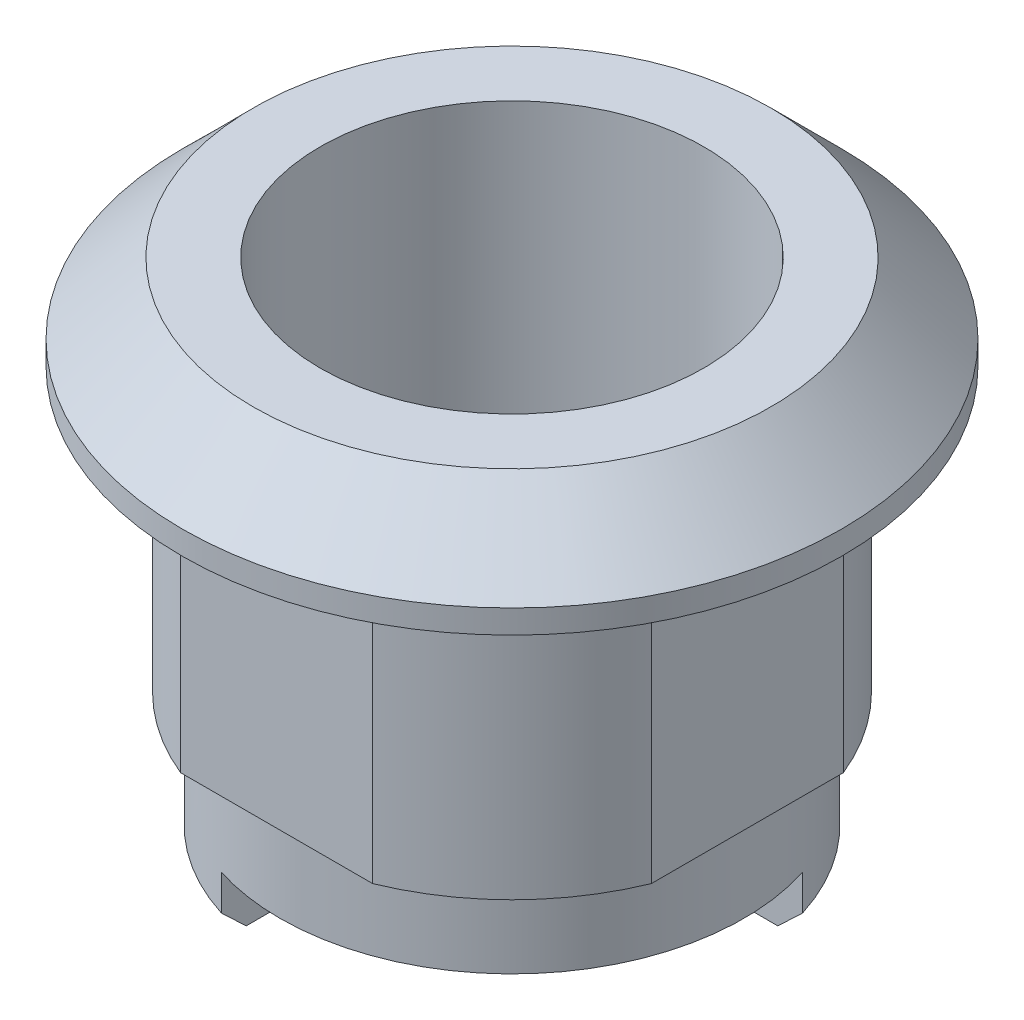
ISO-10303-21;
HEADER;
FILE_DESCRIPTION(('STEP AP214'),'2;1');
FILE_NAME('part.step','',(''),(''),'','','');
FILE_SCHEMA(('AUTOMOTIVE_DESIGN { 1 0 10303 214 1 1 1 1 }'));
ENDSEC;
DATA;
#1=APPLICATION_CONTEXT('core data for automotive mechanical design processes');
#2=APPLICATION_PROTOCOL_DEFINITION('international standard','automotive_design',2000,#1);
#3=PRODUCT_CONTEXT('',#1,'mechanical');
#4=PRODUCT('Part','Part','',(#3));
#5=PRODUCT_RELATED_PRODUCT_CATEGORY('part','',(#4));
#6=PRODUCT_DEFINITION_FORMATION('','',#4);
#7=PRODUCT_DEFINITION_CONTEXT('part definition',#1,'design');
#8=PRODUCT_DEFINITION('design','',#6,#7);
#9=PRODUCT_DEFINITION_SHAPE('','',#8);
#10=(LENGTH_UNIT() NAMED_UNIT(*) SI_UNIT(.MILLI.,.METRE.));
#11=(NAMED_UNIT(*) PLANE_ANGLE_UNIT() SI_UNIT($,.RADIAN.));
#12=(NAMED_UNIT(*) SI_UNIT($,.STERADIAN.) SOLID_ANGLE_UNIT());
#13=UNCERTAINTY_MEASURE_WITH_UNIT(LENGTH_MEASURE(1.E-05),#10,'distance_accuracy_value','');
#14=(GEOMETRIC_REPRESENTATION_CONTEXT(3) GLOBAL_UNCERTAINTY_ASSIGNED_CONTEXT((#13)) GLOBAL_UNIT_ASSIGNED_CONTEXT((#10,
#11,#12)) REPRESENTATION_CONTEXT('',''));
#15=CARTESIAN_POINT('',(0.,0.,0.));
#16=DIRECTION('',(0.,0.,1.));
#17=DIRECTION('',(1.,0.,0.));
#18=AXIS2_PLACEMENT_3D('',#15,#16,#17);
#19=CARTESIAN_POINT('',(9.85,-5.05,0.));
#20=DIRECTION('',(0.,1.,0.));
#21=DIRECTION('',(0.,0.,1.));
#22=AXIS2_PLACEMENT_3D('',#19,#20,#21);
#23=PLANE('',#22);
#24=CARTESIAN_POINT('',(0.,-5.05,0.));
#25=DIRECTION('',(0.,1.,0.));
#26=DIRECTION('',(0.,0.,1.));
#27=AXIS2_PLACEMENT_3D('',#24,#25,#26);
#28=CIRCLE('',#27,9.85);
#29=CARTESIAN_POINT('',(0.,-5.05,9.85));
#30=VERTEX_POINT('',#29);
#31=EDGE_CURVE('E153',#30,#30,#28,.T.);
#32=ORIENTED_EDGE('',*,*,#31,.T.);
#33=EDGE_LOOP('',(#32));
#34=FACE_BOUND('',#33,.T.);
#35=DIRECTION('',(0.,0.,-1.));
#36=VECTOR('',#35,1.);
#37=CARTESIAN_POINT('',(10.,-5.05,0.));
#38=LINE('',#37,#36);
#39=CARTESIAN_POINT('',(10.,-5.05,4.07921561087424));
#40=VERTEX_POINT('',#39);
#41=CARTESIAN_POINT('',(10.,-5.05,-4.07921561087422));
#42=VERTEX_POINT('',#41);
#43=EDGE_CURVE('E316',#40,#42,#38,.T.);
#44=ORIENTED_EDGE('',*,*,#43,.F.);
#45=CARTESIAN_POINT('',(0.,-5.05,0.));
#46=DIRECTION('',(0.,1.,0.));
#47=DIRECTION('',(0.,0.,1.));
#48=AXIS2_PLACEMENT_3D('',#45,#46,#47);
#49=CIRCLE('',#48,10.8);
#50=CARTESIAN_POINT('',(4.07921561087423,-5.05,10.));
#51=VERTEX_POINT('',#50);
#52=EDGE_CURVE('E159',#51,#40,#49,.T.);
#53=ORIENTED_EDGE('',*,*,#52,.F.);
#54=DIRECTION('',(1.,0.,0.));
#55=VECTOR('',#54,1.);
#56=CARTESIAN_POINT('',(9.85,-5.05,10.));
#57=LINE('',#56,#55);
#58=CARTESIAN_POINT('',(-4.07921561087423,-5.05,10.));
#59=VERTEX_POINT('',#58);
#60=EDGE_CURVE('E331',#59,#51,#57,.T.);
#61=ORIENTED_EDGE('',*,*,#60,.F.);
#62=CARTESIAN_POINT('',(-10.,-5.05,4.07921561087422));
#63=VERTEX_POINT('',#62);
#64=EDGE_CURVE('E268',#63,#59,#49,.T.);
#65=ORIENTED_EDGE('',*,*,#64,.F.);
#66=DIRECTION('',(0.,0.,1.));
#67=VECTOR('',#66,1.);
#68=CARTESIAN_POINT('',(-10.,-5.05,0.));
#69=LINE('',#68,#67);
#70=CARTESIAN_POINT('',(-10.,-5.05,-4.07921561087422));
#71=VERTEX_POINT('',#70);
#72=EDGE_CURVE('E300',#71,#63,#69,.T.);
#73=ORIENTED_EDGE('',*,*,#72,.F.);
#74=CARTESIAN_POINT('',(-4.07921561087423,-5.05,-10.));
#75=VERTEX_POINT('',#74);
#76=EDGE_CURVE('E277',#75,#71,#49,.T.);
#77=ORIENTED_EDGE('',*,*,#76,.F.);
#78=DIRECTION('',(-1.,0.,0.));
#79=VECTOR('',#78,1.);
#80=CARTESIAN_POINT('',(9.85,-5.05,-10.));
#81=LINE('',#80,#79);
#82=CARTESIAN_POINT('',(4.07921561087423,-5.05,-10.));
#83=VERTEX_POINT('',#82);
#84=EDGE_CURVE('E299',#83,#75,#81,.T.);
#85=ORIENTED_EDGE('',*,*,#84,.F.);
#86=EDGE_CURVE('E271',#42,#83,#49,.T.);
#87=ORIENTED_EDGE('',*,*,#86,.F.);
#88=EDGE_LOOP('',(#44,#53,#61,#65,#73,#77,#85,#87));
#89=FACE_BOUND('',#88,.T.);
#90=ADVANCED_FACE('F34',(#34,#89),#23,.F.);
#91=CARTESIAN_POINT('',(0.,15.2972027972028,0.));
#92=DIRECTION('',(0.,1.,0.));
#93=DIRECTION('',(0.,0.,1.));
#94=AXIS2_PLACEMENT_3D('',#91,#92,#93);
#95=CYLINDRICAL_SURFACE('',#94,10.8);
#96=DIRECTION('',(0.,1.,0.));
#97=VECTOR('',#96,1.);
#98=CARTESIAN_POINT('',(10.,15.2972027972028,-4.07921561087423));
#99=LINE('',#98,#97);
#100=CARTESIAN_POINT('',(10.,6.95,-4.07921561087422));
#101=VERTEX_POINT('',#100);
#102=EDGE_CURVE('E262',#42,#101,#99,.T.);
#103=ORIENTED_EDGE('',*,*,#102,.F.);
#104=ORIENTED_EDGE('',*,*,#86,.T.);
#105=DIRECTION('',(0.,1.,0.));
#106=VECTOR('',#105,1.);
#107=CARTESIAN_POINT('',(4.07921561087423,15.2972027972028,-10.));
#108=LINE('',#107,#106);
#109=CARTESIAN_POINT('',(4.07921561087423,6.95,-10.));
#110=VERTEX_POINT('',#109);
#111=EDGE_CURVE('E305',#110,#83,#108,.F.);
#112=ORIENTED_EDGE('',*,*,#111,.F.);
#113=CARTESIAN_POINT('',(0.,6.95,0.));
#114=DIRECTION('',(0.,1.,0.));
#115=DIRECTION('',(0.,0.,1.));
#116=AXIS2_PLACEMENT_3D('',#113,#114,#115);
#117=CIRCLE('',#116,10.8);
#118=EDGE_CURVE('E269',#101,#110,#117,.T.);
#119=ORIENTED_EDGE('',*,*,#118,.F.);
#120=EDGE_LOOP('',(#103,#104,#112,#119));
#121=FACE_BOUND('',#120,.T.);
#122=ADVANCED_FACE('F224',(#121),#95,.T.);
#123=DIRECTION('',(0.,1.,0.));
#124=VECTOR('',#123,1.);
#125=CARTESIAN_POINT('',(10.,15.2972027972028,4.07921561087424));
#126=LINE('',#125,#124);
#127=CARTESIAN_POINT('',(10.,6.95,4.07921561087423));
#128=VERTEX_POINT('',#127);
#129=EDGE_CURVE('E314',#128,#40,#126,.F.);
#130=ORIENTED_EDGE('',*,*,#129,.F.);
#131=CARTESIAN_POINT('',(4.07921561087424,6.95,10.));
#132=VERTEX_POINT('',#131);
#133=EDGE_CURVE('E266',#132,#128,#117,.T.);
#134=ORIENTED_EDGE('',*,*,#133,.F.);
#135=DIRECTION('',(0.,1.,0.));
#136=VECTOR('',#135,1.);
#137=CARTESIAN_POINT('',(4.07921561087423,15.2972027972028,10.));
#138=LINE('',#137,#136);
#139=EDGE_CURVE('E307',#51,#132,#138,.T.);
#140=ORIENTED_EDGE('',*,*,#139,.F.);
#141=ORIENTED_EDGE('',*,*,#52,.T.);
#142=EDGE_LOOP('',(#130,#134,#140,#141));
#143=FACE_BOUND('',#142,.T.);
#144=ADVANCED_FACE('F227',(#143),#95,.T.);
#145=DIRECTION('',(0.,1.,0.));
#146=VECTOR('',#145,1.);
#147=CARTESIAN_POINT('',(-4.07921561087423,15.2972027972028,-10.));
#148=LINE('',#147,#146);
#149=CARTESIAN_POINT('',(-4.07921561087423,6.95,-10.));
#150=VERTEX_POINT('',#149);
#151=EDGE_CURVE('E293',#75,#150,#148,.T.);
#152=ORIENTED_EDGE('',*,*,#151,.F.);
#153=ORIENTED_EDGE('',*,*,#76,.T.);
#154=DIRECTION('',(0.,1.,0.));
#155=VECTOR('',#154,1.);
#156=CARTESIAN_POINT('',(-10.,15.2972027972028,-4.07921561087422));
#157=LINE('',#156,#155);
#158=CARTESIAN_POINT('',(-10.,6.95,-4.07921561087422));
#159=VERTEX_POINT('',#158);
#160=EDGE_CURVE('E290',#159,#71,#157,.F.);
#161=ORIENTED_EDGE('',*,*,#160,.F.);
#162=EDGE_CURVE('E323',#150,#159,#117,.T.);
#163=ORIENTED_EDGE('',*,*,#162,.F.);
#164=EDGE_LOOP('',(#152,#153,#161,#163));
#165=FACE_BOUND('',#164,.T.);
#166=ADVANCED_FACE('F288',(#165),#95,.T.);
#167=DIRECTION('',(0.,1.,0.));
#168=VECTOR('',#167,1.);
#169=CARTESIAN_POINT('',(-10.,15.2972027972028,4.07921561087422));
#170=LINE('',#169,#168);
#171=CARTESIAN_POINT('',(-10.,6.95,4.07921561087422));
#172=VERTEX_POINT('',#171);
#173=EDGE_CURVE('E303',#63,#172,#170,.T.);
#174=ORIENTED_EDGE('',*,*,#173,.F.);
#175=ORIENTED_EDGE('',*,*,#64,.T.);
#176=DIRECTION('',(0.,1.,0.));
#177=VECTOR('',#176,1.);
#178=CARTESIAN_POINT('',(-4.07921561087423,15.2972027972028,10.));
#179=LINE('',#178,#177);
#180=CARTESIAN_POINT('',(-4.07921561087424,6.95,10.));
#181=VERTEX_POINT('',#180);
#182=EDGE_CURVE('E330',#181,#59,#179,.F.);
#183=ORIENTED_EDGE('',*,*,#182,.F.);
#184=EDGE_CURVE('E259',#172,#181,#117,.T.);
#185=ORIENTED_EDGE('',*,*,#184,.F.);
#186=EDGE_LOOP('',(#174,#175,#183,#185));
#187=FACE_BOUND('',#186,.T.);
#188=ADVANCED_FACE('F229',(#187),#95,.T.);
#189=CARTESIAN_POINT('',(5.1,-4.65,0.));
#190=DIRECTION('',(0.,-1.,0.));
#191=DIRECTION('',(0.,0.,-1.));
#192=AXIS2_PLACEMENT_3D('',#189,#190,#191);
#193=PLANE('',#192);
#194=CARTESIAN_POINT('',(0.,-4.65,0.));
#195=DIRECTION('',(0.,1.,0.));
#196=DIRECTION('',(0.,0.,1.));
#197=AXIS2_PLACEMENT_3D('',#194,#195,#196);
#198=CIRCLE('',#197,5.1);
#199=CARTESIAN_POINT('',(0.,-4.65,5.1));
#200=VERTEX_POINT('',#199);
#201=EDGE_CURVE('E152',#200,#200,#198,.T.);
#202=ORIENTED_EDGE('',*,*,#201,.F.);
#203=EDGE_LOOP('',(#202));
#204=FACE_BOUND('',#203,.T.);
#205=CARTESIAN_POINT('',(0.,-4.65,0.));
#206=DIRECTION('',(0.,1.,0.));
#207=DIRECTION('',(0.,0.,1.));
#208=AXIS2_PLACEMENT_3D('',#205,#206,#207);
#209=CIRCLE('',#208,8.15);
#210=CARTESIAN_POINT('',(0.,-4.65,8.15));
#211=VERTEX_POINT('',#210);
#212=EDGE_CURVE('E256',#211,#211,#209,.T.);
#213=ORIENTED_EDGE('',*,*,#212,.T.);
#214=EDGE_LOOP('',(#213));
#215=FACE_BOUND('',#214,.T.);
#216=ADVANCED_FACE('F240',(#204,#215),#193,.F.);
#217=CARTESIAN_POINT('',(0.,15.2972027972028,0.));
#218=DIRECTION('',(0.,1.,0.));
#219=DIRECTION('',(0.,0.,1.));
#220=AXIS2_PLACEMENT_3D('',#217,#218,#219);
#221=CYLINDRICAL_SURFACE('',#220,5.1);
#222=CARTESIAN_POINT('',(0.,-8.45,0.));
#223=DIRECTION('',(0.,1.,0.));
#224=DIRECTION('',(0.,0.,1.));
#225=AXIS2_PLACEMENT_3D('',#222,#223,#224);
#226=CIRCLE('',#225,5.1);
#227=CARTESIAN_POINT('',(4.16022835911684,-8.45,-2.95));
#228=VERTEX_POINT('',#227);
#229=CARTESIAN_POINT('',(-2.95,-8.45,4.16022835911684));
#230=VERTEX_POINT('',#229);
#231=EDGE_CURVE('E147',#228,#230,#226,.F.);
#232=ORIENTED_EDGE('',*,*,#231,.T.);
#233=DIRECTION('',(0.,1.,0.));
#234=VECTOR('',#233,1.);
#235=CARTESIAN_POINT('',(-2.95,15.2972027972028,4.16022835911684));
#236=LINE('',#235,#234);
#237=CARTESIAN_POINT('',(-2.95,-10.95,4.16022835911684));
#238=VERTEX_POINT('',#237);
#239=EDGE_CURVE('E135',#230,#238,#236,.F.);
#240=ORIENTED_EDGE('',*,*,#239,.T.);
#241=CARTESIAN_POINT('',(0.,-10.95,0.));
#242=DIRECTION('',(0.,1.,0.));
#243=DIRECTION('',(0.,0.,1.));
#244=AXIS2_PLACEMENT_3D('',#241,#242,#243);
#245=CIRCLE('',#244,5.1);
#246=CARTESIAN_POINT('',(4.16022835911684,-10.95,-2.95));
#247=VERTEX_POINT('',#246);
#248=EDGE_CURVE('E146',#247,#238,#245,.T.);
#249=ORIENTED_EDGE('',*,*,#248,.F.);
#250=DIRECTION('',(0.,1.,0.));
#251=VECTOR('',#250,1.);
#252=CARTESIAN_POINT('',(4.16022835911684,15.2972027972028,-2.95));
#253=LINE('',#252,#251);
#254=EDGE_CURVE('E149',#247,#228,#253,.T.);
#255=ORIENTED_EDGE('',*,*,#254,.T.);
#256=EDGE_LOOP('',(#232,#240,#249,#255));
#257=FACE_BOUND('',#256,.T.);
#258=ORIENTED_EDGE('',*,*,#201,.T.);
#259=EDGE_LOOP('',(#258));
#260=FACE_BOUND('',#259,.T.);
#261=ADVANCED_FACE('F143',(#257,#260),#221,.F.);
#262=CARTESIAN_POINT('',(9.85,-10.95,0.));
#263=DIRECTION('',(0.,1.,0.));
#264=DIRECTION('',(0.,0.,1.));
#265=AXIS2_PLACEMENT_3D('',#262,#263,#264);
#266=PLANE('',#265);
#267=DIRECTION('',(0.,0.,-1.));
#268=VECTOR('',#267,1.);
#269=CARTESIAN_POINT('',(-2.95,-10.95,-2.95));
#270=LINE('',#269,#268);
#271=CARTESIAN_POINT('',(-2.95,-10.95,8.34386001800128));
#272=VERTEX_POINT('',#271);
#273=EDGE_CURVE('E131',#272,#238,#270,.T.);
#274=ORIENTED_EDGE('',*,*,#273,.F.);
#275=CARTESIAN_POINT('',(0.,-10.95,0.));
#276=DIRECTION('',(0.,1.,0.));
#277=DIRECTION('',(0.,0.,1.));
#278=AXIS2_PLACEMENT_3D('',#275,#276,#277);
#279=CIRCLE('',#278,8.85000000000001);
#280=CARTESIAN_POINT('',(8.34386001800128,-10.95,-2.95));
#281=VERTEX_POINT('',#280);
#282=EDGE_CURVE('E48',#272,#281,#279,.F.);
#283=ORIENTED_EDGE('',*,*,#282,.T.);
#284=DIRECTION('',(1.,0.,0.));
#285=VECTOR('',#284,1.);
#286=CARTESIAN_POINT('',(-2.95,-10.95,-2.95));
#287=LINE('',#286,#285);
#288=EDGE_CURVE('E138',#247,#281,#287,.T.);
#289=ORIENTED_EDGE('',*,*,#288,.F.);
#290=ORIENTED_EDGE('',*,*,#248,.T.);
#291=EDGE_LOOP('',(#274,#283,#289,#290));
#292=FACE_BOUND('',#291,.T.);
#293=ADVANCED_FACE('F151',(#292),#266,.F.);
#294=CARTESIAN_POINT('',(0.,15.2972027972028,0.));
#295=DIRECTION('',(0.,1.,0.));
#296=DIRECTION('',(0.,0.,1.));
#297=AXIS2_PLACEMENT_3D('',#294,#295,#296);
#298=CYLINDRICAL_SURFACE('',#297,9.85);
#299=DIRECTION('',(0.,1.,0.));
#300=VECTOR('',#299,1.);
#301=CARTESIAN_POINT('',(9.39787209957659,15.2972027972028,-2.95));
#302=LINE('',#301,#300);
#303=CARTESIAN_POINT('',(9.39787209957659,-8.45,-2.95));
#304=VERTEX_POINT('',#303);
#305=CARTESIAN_POINT('',(9.39787209957659,-9.95000000000001,-2.95));
#306=VERTEX_POINT('',#305);
#307=EDGE_CURVE('E171',#304,#306,#302,.F.);
#308=ORIENTED_EDGE('',*,*,#307,.T.);
#309=CARTESIAN_POINT('',(0.,-9.95000000000001,0.));
#310=DIRECTION('',(0.,1.,0.));
#311=DIRECTION('',(0.,0.,1.));
#312=AXIS2_PLACEMENT_3D('',#309,#310,#311);
#313=CIRCLE('',#312,9.85);
#314=CARTESIAN_POINT('',(-2.95,-9.95000000000001,9.39787209957659));
#315=VERTEX_POINT('',#314);
#316=EDGE_CURVE('E176',#306,#315,#313,.T.);
#317=ORIENTED_EDGE('',*,*,#316,.T.);
#318=DIRECTION('',(0.,1.,0.));
#319=VECTOR('',#318,1.);
#320=CARTESIAN_POINT('',(-2.95,15.2972027972028,9.39787209957659));
#321=LINE('',#320,#319);
#322=CARTESIAN_POINT('',(-2.95,-8.45,9.39787209957659));
#323=VERTEX_POINT('',#322);
#324=EDGE_CURVE('E174',#315,#323,#321,.T.);
#325=ORIENTED_EDGE('',*,*,#324,.T.);
#326=CARTESIAN_POINT('',(0.,-8.45,0.));
#327=DIRECTION('',(0.,1.,0.));
#328=DIRECTION('',(0.,0.,1.));
#329=AXIS2_PLACEMENT_3D('',#326,#327,#328);
#330=CIRCLE('',#329,9.85);
#331=EDGE_CURVE('E168',#323,#304,#330,.T.);
#332=ORIENTED_EDGE('',*,*,#331,.T.);
#333=EDGE_LOOP('',(#308,#317,#325,#332));
#334=FACE_BOUND('',#333,.T.);
#335=ORIENTED_EDGE('',*,*,#31,.F.);
#336=EDGE_LOOP('',(#335));
#337=FACE_BOUND('',#336,.T.);
#338=ADVANCED_FACE('F222',(#334,#337),#298,.T.);
#339=CARTESIAN_POINT('',(14.,6.95,0.));
#340=DIRECTION('',(0.,1.,0.));
#341=DIRECTION('',(0.,0.,1.));
#342=AXIS2_PLACEMENT_3D('',#339,#340,#341);
#343=PLANE('',#342);
#344=ORIENTED_EDGE('',*,*,#133,.T.);
#345=DIRECTION('',(0.,0.,1.));
#346=VECTOR('',#345,1.);
#347=CARTESIAN_POINT('',(10.,6.95,10.));
#348=LINE('',#347,#346);
#349=EDGE_CURVE('E320',#101,#128,#348,.T.);
#350=ORIENTED_EDGE('',*,*,#349,.F.);
#351=ORIENTED_EDGE('',*,*,#118,.T.);
#352=DIRECTION('',(1.,0.,0.));
#353=VECTOR('',#352,1.);
#354=CARTESIAN_POINT('',(-10.,6.95,-10.));
#355=LINE('',#354,#353);
#356=EDGE_CURVE('E148',#150,#110,#355,.T.);
#357=ORIENTED_EDGE('',*,*,#356,.F.);
#358=ORIENTED_EDGE('',*,*,#162,.T.);
#359=DIRECTION('',(0.,0.,-1.));
#360=VECTOR('',#359,1.);
#361=CARTESIAN_POINT('',(-10.,6.95,10.));
#362=LINE('',#361,#360);
#363=EDGE_CURVE('E329',#172,#159,#362,.T.);
#364=ORIENTED_EDGE('',*,*,#363,.F.);
#365=ORIENTED_EDGE('',*,*,#184,.T.);
#366=DIRECTION('',(-1.,0.,0.));
#367=VECTOR('',#366,1.);
#368=CARTESIAN_POINT('',(-10.,6.95,10.));
#369=LINE('',#368,#367);
#370=EDGE_CURVE('E327',#132,#181,#369,.T.);
#371=ORIENTED_EDGE('',*,*,#370,.F.);
#372=EDGE_LOOP('',(#344,#350,#351,#357,#358,#364,#365,#371));
#373=FACE_BOUND('',#372,.T.);
#374=CARTESIAN_POINT('',(0.,6.95,0.));
#375=DIRECTION('',(0.,1.,0.));
#376=DIRECTION('',(0.,0.,1.));
#377=AXIS2_PLACEMENT_3D('',#374,#375,#376);
#378=CIRCLE('',#377,14.);
#379=CARTESIAN_POINT('',(0.,6.95,14.));
#380=VERTEX_POINT('',#379);
#381=EDGE_CURVE('E255',#380,#380,#378,.T.);
#382=ORIENTED_EDGE('',*,*,#381,.F.);
#383=EDGE_LOOP('',(#382));
#384=FACE_BOUND('',#383,.T.);
#385=ADVANCED_FACE('F218',(#373,#384),#343,.F.);
#386=CARTESIAN_POINT('',(0.,15.2972027972028,0.));
#387=DIRECTION('',(0.,1.,0.));
#388=DIRECTION('',(0.,0.,1.));
#389=AXIS2_PLACEMENT_3D('',#386,#387,#388);
#390=CYLINDRICAL_SURFACE('',#389,14.);
#391=CARTESIAN_POINT('',(0.,7.94999999999999,0.));
#392=DIRECTION('',(0.,-1.,0.));
#393=DIRECTION('',(0.,0.,-1.));
#394=AXIS2_PLACEMENT_3D('',#391,#392,#393);
#395=CIRCLE('',#394,14.);
#396=CARTESIAN_POINT('',(0.,7.94999999999999,-14.));
#397=VERTEX_POINT('',#396);
#398=EDGE_CURVE('E165',#397,#397,#395,.T.);
#399=ORIENTED_EDGE('',*,*,#398,.T.);
#400=EDGE_LOOP('',(#399));
#401=FACE_BOUND('',#400,.T.);
#402=ORIENTED_EDGE('',*,*,#381,.T.);
#403=EDGE_LOOP('',(#402));
#404=FACE_BOUND('',#403,.T.);
#405=ADVANCED_FACE('F214',(#401,#404),#390,.T.);
#406=CARTESIAN_POINT('',(8.15,10.95,0.));
#407=DIRECTION('',(0.,-1.,0.));
#408=DIRECTION('',(0.,0.,-1.));
#409=AXIS2_PLACEMENT_3D('',#406,#407,#408);
#410=PLANE('',#409);
#411=CARTESIAN_POINT('',(0.,10.95,0.));
#412=DIRECTION('',(0.,-1.,0.));
#413=DIRECTION('',(0.,0.,-1.));
#414=AXIS2_PLACEMENT_3D('',#411,#412,#413);
#415=CIRCLE('',#414,11.);
#416=CARTESIAN_POINT('',(0.,10.95,-11.));
#417=VERTEX_POINT('',#416);
#418=EDGE_CURVE('E156',#417,#417,#415,.F.);
#419=ORIENTED_EDGE('',*,*,#418,.T.);
#420=EDGE_LOOP('',(#419));
#421=FACE_BOUND('',#420,.T.);
#422=CARTESIAN_POINT('',(0.,10.95,0.));
#423=DIRECTION('',(0.,1.,0.));
#424=DIRECTION('',(0.,0.,1.));
#425=AXIS2_PLACEMENT_3D('',#422,#423,#424);
#426=CIRCLE('',#425,8.15);
#427=CARTESIAN_POINT('',(0.,10.95,8.15));
#428=VERTEX_POINT('',#427);
#429=EDGE_CURVE('E253',#428,#428,#426,.T.);
#430=ORIENTED_EDGE('',*,*,#429,.F.);
#431=EDGE_LOOP('',(#430));
#432=FACE_BOUND('',#431,.T.);
#433=ADVANCED_FACE('F210',(#421,#432),#410,.F.);
#434=CARTESIAN_POINT('',(0.,15.2972027972028,0.));
#435=DIRECTION('',(0.,1.,0.));
#436=DIRECTION('',(0.,0.,1.));
#437=AXIS2_PLACEMENT_3D('',#434,#435,#436);
#438=CYLINDRICAL_SURFACE('',#437,8.15);
#439=ORIENTED_EDGE('',*,*,#212,.F.);
#440=EDGE_LOOP('',(#439));
#441=FACE_BOUND('',#440,.T.);
#442=ORIENTED_EDGE('',*,*,#429,.T.);
#443=EDGE_LOOP('',(#442));
#444=FACE_BOUND('',#443,.T.);
#445=ADVANCED_FACE('F207',(#441,#444),#438,.F.);
#446=CARTESIAN_POINT('',(0.,10.95,0.));
#447=DIRECTION('',(0.,-1.,0.));
#448=DIRECTION('',(0.,0.,-1.));
#449=AXIS2_PLACEMENT_3D('',#446,#447,#448);
#450=CONICAL_SURFACE('',#449,11.,0.785398163397446);
#451=ORIENTED_EDGE('',*,*,#398,.F.);
#452=EDGE_LOOP('',(#451));
#453=FACE_BOUND('',#452,.T.);
#454=ORIENTED_EDGE('',*,*,#418,.F.);
#455=EDGE_LOOP('',(#454));
#456=FACE_BOUND('',#455,.T.);
#457=ADVANCED_FACE('F195',(#453,#456),#450,.T.);
#458=CARTESIAN_POINT('',(-10.,59.7832524564484,10.));
#459=DIRECTION('',(0.,0.,1.));
#460=DIRECTION('',(1.,0.,0.));
#461=AXIS2_PLACEMENT_3D('',#458,#459,#460);
#462=PLANE('',#461);
#463=ORIENTED_EDGE('',*,*,#139,.T.);
#464=ORIENTED_EDGE('',*,*,#370,.T.);
#465=ORIENTED_EDGE('',*,*,#182,.T.);
#466=ORIENTED_EDGE('',*,*,#60,.T.);
#467=EDGE_LOOP('',(#463,#464,#465,#466));
#468=FACE_BOUND('',#467,.T.);
#469=ADVANCED_FACE('F191',(#468),#462,.T.);
#470=CARTESIAN_POINT('',(-10.,59.7832524564484,10.));
#471=DIRECTION('',(-1.,0.,0.));
#472=DIRECTION('',(0.,0.,1.));
#473=AXIS2_PLACEMENT_3D('',#470,#471,#472);
#474=PLANE('',#473);
#475=ORIENTED_EDGE('',*,*,#173,.T.);
#476=ORIENTED_EDGE('',*,*,#363,.T.);
#477=ORIENTED_EDGE('',*,*,#160,.T.);
#478=ORIENTED_EDGE('',*,*,#72,.T.);
#479=EDGE_LOOP('',(#475,#476,#477,#478));
#480=FACE_BOUND('',#479,.T.);
#481=ADVANCED_FACE('F194',(#480),#474,.T.);
#482=CARTESIAN_POINT('',(-10.,59.7832524564484,-10.));
#483=DIRECTION('',(0.,0.,-1.));
#484=DIRECTION('',(-1.,0.,0.));
#485=AXIS2_PLACEMENT_3D('',#482,#483,#484);
#486=PLANE('',#485);
#487=ORIENTED_EDGE('',*,*,#151,.T.);
#488=ORIENTED_EDGE('',*,*,#356,.T.);
#489=ORIENTED_EDGE('',*,*,#111,.T.);
#490=ORIENTED_EDGE('',*,*,#84,.T.);
#491=EDGE_LOOP('',(#487,#488,#489,#490));
#492=FACE_BOUND('',#491,.T.);
#493=ADVANCED_FACE('F199',(#492),#486,.T.);
#494=CARTESIAN_POINT('',(10.,59.7832524564484,10.));
#495=DIRECTION('',(1.,0.,0.));
#496=DIRECTION('',(0.,0.,-1.));
#497=AXIS2_PLACEMENT_3D('',#494,#495,#496);
#498=PLANE('',#497);
#499=ORIENTED_EDGE('',*,*,#102,.T.);
#500=ORIENTED_EDGE('',*,*,#349,.T.);
#501=ORIENTED_EDGE('',*,*,#129,.T.);
#502=ORIENTED_EDGE('',*,*,#43,.T.);
#503=EDGE_LOOP('',(#499,#500,#501,#502));
#504=FACE_BOUND('',#503,.T.);
#505=ADVANCED_FACE('F188',(#504),#498,.T.);
#506=CARTESIAN_POINT('',(-2.95,-8.45,-2.95));
#507=DIRECTION('',(-1.,0.,0.));
#508=DIRECTION('',(0.,0.,1.));
#509=AXIS2_PLACEMENT_3D('',#506,#507,#508);
#510=PLANE('',#509);
#511=ORIENTED_EDGE('',*,*,#324,.F.);
#512=CARTESIAN_POINT('',(-2.95,-9.95000000000001,9.39787209957659));
#513=CARTESIAN_POINT('',(-2.95,-10.0335793469142,9.31027143777885));
#514=CARTESIAN_POINT('',(-2.95,-10.117104179672,9.22261873860833));
#515=CARTESIAN_POINT('',(-2.95,-10.2840344191576,9.04720006458263));
#516=CARTESIAN_POINT('',(-2.95,-10.3674398261473,8.95943408997662));
#517=CARTESIAN_POINT('',(-2.95,-10.5341212108196,8.78377925074261));
#518=CARTESIAN_POINT('',(-2.95,-10.61739718846,8.6958903860744));
#519=CARTESIAN_POINT('',(-2.95,-10.7838077328407,8.51997852364347));
#520=CARTESIAN_POINT('',(-2.95,-10.86694229927,8.43195552558651));
#521=CARTESIAN_POINT('',(-2.95,-10.95,8.34386001800127));
#522=B_SPLINE_CURVE_WITH_KNOTS('',3,(#512,#513,#514,#515,#516,#517,#518,#519,#520,#521),
.UNSPECIFIED.,.F.,.F.,(4,2,2,2,4),(0.,0.363227822330495,0.726454847010824,1.08968199054159,
1.45290993198194),.UNSPECIFIED.);
#523=EDGE_CURVE('E62',#315,#272,#522,.T.);
#524=ORIENTED_EDGE('',*,*,#523,.T.);
#525=ORIENTED_EDGE('',*,*,#273,.T.);
#526=ORIENTED_EDGE('',*,*,#239,.F.);
#527=DIRECTION('',(0.,0.,-1.));
#528=VECTOR('',#527,1.);
#529=CARTESIAN_POINT('',(-2.95,-8.45,-2.95));
#530=LINE('',#529,#528);
#531=EDGE_CURVE('E343',#323,#230,#530,.T.);
#532=ORIENTED_EDGE('',*,*,#531,.F.);
#533=EDGE_LOOP('',(#511,#524,#525,#526,#532));
#534=FACE_BOUND('',#533,.T.);
#535=ADVANCED_FACE('F133',(#534),#510,.F.);
#536=CARTESIAN_POINT('',(-2.95,-8.45,-2.95));
#537=DIRECTION('',(0.,0.,-1.));
#538=DIRECTION('',(-1.,0.,0.));
#539=AXIS2_PLACEMENT_3D('',#536,#537,#538);
#540=PLANE('',#539);
#541=ORIENTED_EDGE('',*,*,#288,.T.);
#542=CARTESIAN_POINT('',(8.34386001800127,-10.95,-2.95));
#543=CARTESIAN_POINT('',(8.43195552558651,-10.86694229927,-2.95));
#544=CARTESIAN_POINT('',(8.51997852364347,-10.7838077328407,-2.95));
#545=CARTESIAN_POINT('',(8.6958903860744,-10.61739718846,-2.95));
#546=CARTESIAN_POINT('',(8.78377925074261,-10.5341212108196,-2.95));
#547=CARTESIAN_POINT('',(8.95943408997662,-10.3674398261473,-2.95));
#548=CARTESIAN_POINT('',(9.04720006458263,-10.2840344191576,-2.95));
#549=CARTESIAN_POINT('',(9.22261873860833,-10.117104179672,-2.95));
#550=CARTESIAN_POINT('',(9.31027143777885,-10.0335793469142,-2.95));
#551=CARTESIAN_POINT('',(9.39787209957659,-9.95000000000001,-2.95));
#552=B_SPLINE_CURVE_WITH_KNOTS('',3,(#542,#543,#544,#545,#546,#547,#548,#549,#550,#551),
.UNSPECIFIED.,.F.,.F.,(4,2,2,2,4),(0.,0.363227941440353,0.726455084971119,1.08968210965145,
1.45290993198194),.UNSPECIFIED.);
#553=EDGE_CURVE('E11',#281,#306,#552,.T.);
#554=ORIENTED_EDGE('',*,*,#553,.T.);
#555=ORIENTED_EDGE('',*,*,#307,.F.);
#556=DIRECTION('',(1.,0.,0.));
#557=VECTOR('',#556,1.);
#558=CARTESIAN_POINT('',(-2.95,-8.45,-2.95));
#559=LINE('',#558,#557);
#560=EDGE_CURVE('E342',#228,#304,#559,.T.);
#561=ORIENTED_EDGE('',*,*,#560,.F.);
#562=ORIENTED_EDGE('',*,*,#254,.F.);
#563=EDGE_LOOP('',(#541,#554,#555,#561,#562));
#564=FACE_BOUND('',#563,.T.);
#565=ADVANCED_FACE('F187',(#564),#540,.F.);
#566=CARTESIAN_POINT('',(0.,-8.45,0.));
#567=DIRECTION('',(0.,1.,0.));
#568=DIRECTION('',(0.,0.,1.));
#569=AXIS2_PLACEMENT_3D('',#566,#567,#568);
#570=PLANE('',#569);
#571=ORIENTED_EDGE('',*,*,#560,.T.);
#572=ORIENTED_EDGE('',*,*,#331,.F.);
#573=ORIENTED_EDGE('',*,*,#531,.T.);
#574=ORIENTED_EDGE('',*,*,#231,.F.);
#575=EDGE_LOOP('',(#571,#572,#573,#574));
#576=FACE_BOUND('',#575,.T.);
#577=ADVANCED_FACE('F348',(#576),#570,.F.);
#578=CARTESIAN_POINT('',(0.,-9.95000000000001,0.));
#579=DIRECTION('',(0.,1.,0.));
#580=DIRECTION('',(0.,0.,1.));
#581=AXIS2_PLACEMENT_3D('',#578,#579,#580);
#582=CONICAL_SURFACE('',#581,9.85,0.785398163397447);
#583=ORIENTED_EDGE('',*,*,#553,.F.);
#584=ORIENTED_EDGE('',*,*,#282,.F.);
#585=ORIENTED_EDGE('',*,*,#523,.F.);
#586=ORIENTED_EDGE('',*,*,#316,.F.);
#587=EDGE_LOOP('',(#583,#584,#585,#586));
#588=FACE_BOUND('',#587,.T.);
#589=ADVANCED_FACE('F36',(#588),#582,.T.);
#590=CLOSED_SHELL('',(#90,#122,#144,#166,#188,#216,#261,#293,#338,#385,#405,#433,#445,#457,#469,
#481,#493,#505,#535,#565,#577,#589));
#591=MANIFOLD_SOLID_BREP('B2',#590);
#592=ADVANCED_BREP_SHAPE_REPRESENTATION('',(#18,#591),#14);
#593=SHAPE_DEFINITION_REPRESENTATION(#9,#592);
ENDSEC;
END-ISO-10303-21;
